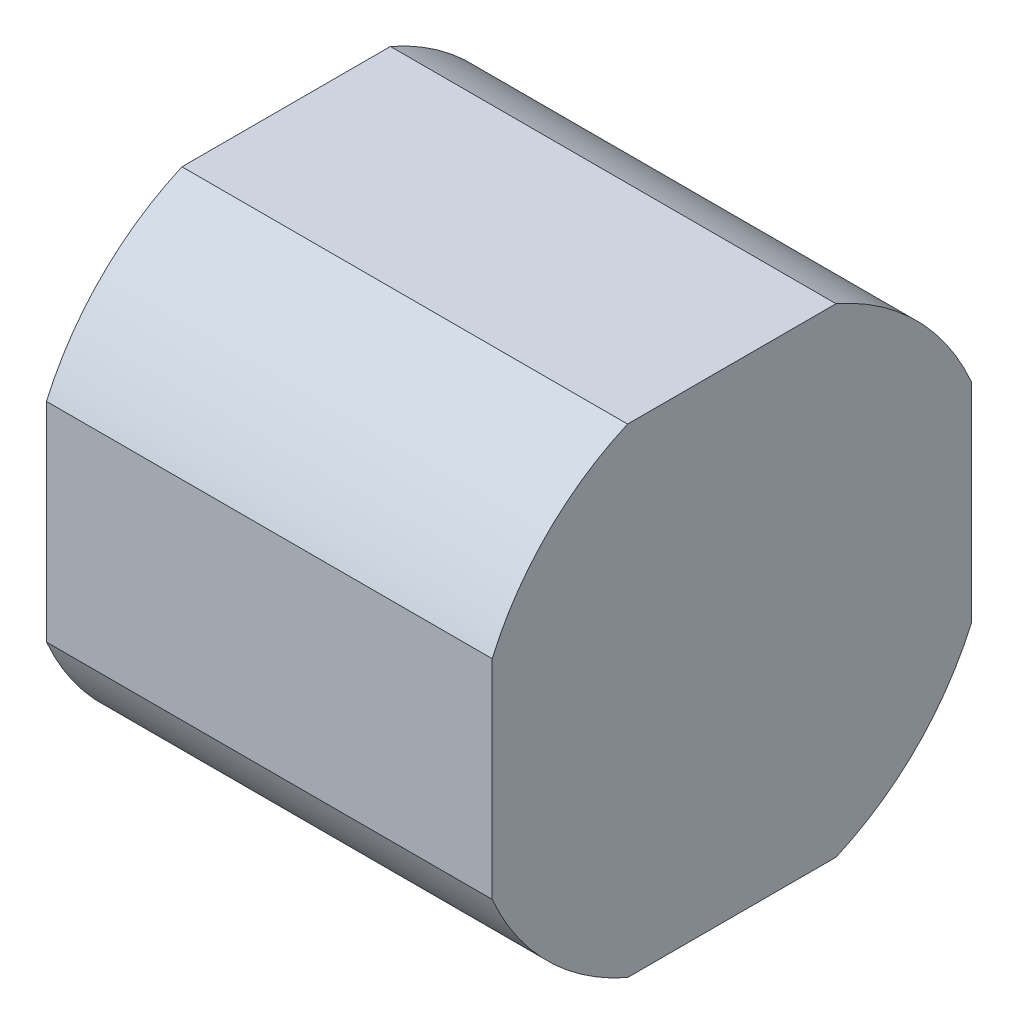
ISO-10303-21;
HEADER;
FILE_DESCRIPTION(('STEP AP214'),'2;1');
FILE_NAME('part.step','',(''),(''),'','','');
FILE_SCHEMA(('AUTOMOTIVE_DESIGN { 1 0 10303 214 1 1 1 1 }'));
ENDSEC;
DATA;
#1=APPLICATION_CONTEXT('core data for automotive mechanical design processes');
#2=APPLICATION_PROTOCOL_DEFINITION('international standard','automotive_design',2000,#1);
#3=PRODUCT_CONTEXT('',#1,'mechanical');
#4=PRODUCT('Part','Part','',(#3));
#5=PRODUCT_RELATED_PRODUCT_CATEGORY('part','',(#4));
#6=PRODUCT_DEFINITION_FORMATION('','',#4);
#7=PRODUCT_DEFINITION_CONTEXT('part definition',#1,'design');
#8=PRODUCT_DEFINITION('design','',#6,#7);
#9=PRODUCT_DEFINITION_SHAPE('','',#8);
#10=(LENGTH_UNIT() NAMED_UNIT(*) SI_UNIT(.MILLI.,.METRE.));
#11=(NAMED_UNIT(*) PLANE_ANGLE_UNIT() SI_UNIT($,.RADIAN.));
#12=(NAMED_UNIT(*) SI_UNIT($,.STERADIAN.) SOLID_ANGLE_UNIT());
#13=UNCERTAINTY_MEASURE_WITH_UNIT(LENGTH_MEASURE(1.E-05),#10,'distance_accuracy_value','');
#14=(GEOMETRIC_REPRESENTATION_CONTEXT(3) GLOBAL_UNCERTAINTY_ASSIGNED_CONTEXT((#13)) GLOBAL_UNIT_ASSIGNED_CONTEXT((#10,
#11,#12)) REPRESENTATION_CONTEXT('',''));
#15=CARTESIAN_POINT('',(0.,0.,0.));
#16=DIRECTION('',(0.,0.,1.));
#17=DIRECTION('',(1.,0.,0.));
#18=AXIS2_PLACEMENT_3D('',#15,#16,#17);
#19=CARTESIAN_POINT('',(18.5,0.,0.));
#20=DIRECTION('',(-1.,0.,0.));
#21=DIRECTION('',(0.,0.,1.));
#22=AXIS2_PLACEMENT_3D('',#19,#20,#21);
#23=CYLINDRICAL_SURFACE('',#22,10.85);
#24=CARTESIAN_POINT('',(0.,0.,0.));
#25=DIRECTION('',(1.,0.,0.));
#26=DIRECTION('',(0.,0.,-1.));
#27=AXIS2_PLACEMENT_3D('',#24,#25,#26);
#28=CIRCLE('',#27,10.85);
#29=CARTESIAN_POINT('',(0.,9.94999999999999,4.32666153055679));
#30=VERTEX_POINT('',#29);
#31=CARTESIAN_POINT('',(0.,4.3266615305568,9.94999999999999));
#32=VERTEX_POINT('',#31);
#33=EDGE_CURVE('E136',#30,#32,#28,.T.);
#34=ORIENTED_EDGE('',*,*,#33,.T.);
#35=DIRECTION('',(-1.,0.,0.));
#36=VECTOR('',#35,1.);
#37=CARTESIAN_POINT('',(18.5,4.3266615305568,9.94999999999999));
#38=LINE('',#37,#36);
#39=CARTESIAN_POINT('',(18.5,4.3266615305568,9.94999999999999));
#40=VERTEX_POINT('',#39);
#41=EDGE_CURVE('E11',#40,#32,#38,.T.);
#42=ORIENTED_EDGE('',*,*,#41,.F.);
#43=CARTESIAN_POINT('',(18.5,0.,0.));
#44=DIRECTION('',(1.,0.,0.));
#45=DIRECTION('',(0.,0.,-1.));
#46=AXIS2_PLACEMENT_3D('',#43,#44,#45);
#47=CIRCLE('',#46,10.85);
#48=CARTESIAN_POINT('',(18.5,9.94999999999999,4.32666153055679));
#49=VERTEX_POINT('',#48);
#50=EDGE_CURVE('E150',#49,#40,#47,.T.);
#51=ORIENTED_EDGE('',*,*,#50,.F.);
#52=DIRECTION('',(-1.,0.,0.));
#53=VECTOR('',#52,1.);
#54=CARTESIAN_POINT('',(18.5,9.94999999999999,4.32666153055679));
#55=LINE('',#54,#53);
#56=EDGE_CURVE('E132',#49,#30,#55,.T.);
#57=ORIENTED_EDGE('',*,*,#56,.T.);
#58=EDGE_LOOP('',(#34,#42,#51,#57));
#59=FACE_BOUND('',#58,.T.);
#60=ADVANCED_FACE('F40',(#59),#23,.T.);
#61=CARTESIAN_POINT('',(18.5,-4.3266615305568,9.94999999999999));
#62=DIRECTION('',(0.,0.,-1.));
#63=DIRECTION('',(-1.,0.,0.));
#64=AXIS2_PLACEMENT_3D('',#61,#62,#63);
#65=PLANE('',#64);
#66=DIRECTION('',(0.,-1.,0.));
#67=VECTOR('',#66,1.);
#68=CARTESIAN_POINT('',(0.,-4.3266615305568,9.94999999999999));
#69=LINE('',#68,#67);
#70=CARTESIAN_POINT('',(0.,-4.32666153055679,9.94999999999999));
#71=VERTEX_POINT('',#70);
#72=EDGE_CURVE('E139',#32,#71,#69,.T.);
#73=ORIENTED_EDGE('',*,*,#72,.T.);
#74=DIRECTION('',(-1.,0.,0.));
#75=VECTOR('',#74,1.);
#76=CARTESIAN_POINT('',(18.5,-4.32666153055679,9.94999999999999));
#77=LINE('',#76,#75);
#78=CARTESIAN_POINT('',(18.5,-4.32666153055679,9.94999999999999));
#79=VERTEX_POINT('',#78);
#80=EDGE_CURVE('E48',#79,#71,#77,.T.);
#81=ORIENTED_EDGE('',*,*,#80,.F.);
#82=DIRECTION('',(0.,-1.,0.));
#83=VECTOR('',#82,1.);
#84=CARTESIAN_POINT('',(18.5,-4.3266615305568,9.94999999999999));
#85=LINE('',#84,#83);
#86=EDGE_CURVE('E99',#40,#79,#85,.T.);
#87=ORIENTED_EDGE('',*,*,#86,.F.);
#88=ORIENTED_EDGE('',*,*,#41,.T.);
#89=EDGE_LOOP('',(#73,#81,#87,#88));
#90=FACE_BOUND('',#89,.T.);
#91=ADVANCED_FACE('F185',(#90),#65,.F.);
#92=CARTESIAN_POINT('',(18.5,0.,0.));
#93=DIRECTION('',(-1.,0.,0.));
#94=DIRECTION('',(0.,0.,1.));
#95=AXIS2_PLACEMENT_3D('',#92,#93,#94);
#96=CYLINDRICAL_SURFACE('',#95,10.85);
#97=CARTESIAN_POINT('',(0.,0.,0.));
#98=DIRECTION('',(1.,0.,0.));
#99=DIRECTION('',(0.,0.,-1.));
#100=AXIS2_PLACEMENT_3D('',#97,#98,#99);
#101=CIRCLE('',#100,10.85);
#102=CARTESIAN_POINT('',(0.,-9.95,4.32666153055678));
#103=VERTEX_POINT('',#102);
#104=EDGE_CURVE('E141',#71,#103,#101,.T.);
#105=ORIENTED_EDGE('',*,*,#104,.T.);
#106=DIRECTION('',(-1.,0.,0.));
#107=VECTOR('',#106,1.);
#108=CARTESIAN_POINT('',(18.5,-9.95,4.32666153055678));
#109=LINE('',#108,#107);
#110=CARTESIAN_POINT('',(18.5,-9.95,4.32666153055678));
#111=VERTEX_POINT('',#110);
#112=EDGE_CURVE('E157',#111,#103,#109,.T.);
#113=ORIENTED_EDGE('',*,*,#112,.F.);
#114=CARTESIAN_POINT('',(18.5,0.,0.));
#115=DIRECTION('',(1.,0.,0.));
#116=DIRECTION('',(0.,0.,-1.));
#117=AXIS2_PLACEMENT_3D('',#114,#115,#116);
#118=CIRCLE('',#117,10.85);
#119=EDGE_CURVE('E165',#79,#111,#118,.T.);
#120=ORIENTED_EDGE('',*,*,#119,.F.);
#121=ORIENTED_EDGE('',*,*,#80,.T.);
#122=EDGE_LOOP('',(#105,#113,#120,#121));
#123=FACE_BOUND('',#122,.T.);
#124=ADVANCED_FACE('F163',(#123),#96,.T.);
#125=CARTESIAN_POINT('',(18.5,-9.95,4.32666153055678));
#126=DIRECTION('',(0.,1.,0.));
#127=DIRECTION('',(0.,0.,1.));
#128=AXIS2_PLACEMENT_3D('',#125,#126,#127);
#129=PLANE('',#128);
#130=DIRECTION('',(0.,0.,-1.));
#131=VECTOR('',#130,1.);
#132=CARTESIAN_POINT('',(0.,-9.95,4.32666153055678));
#133=LINE('',#132,#131);
#134=CARTESIAN_POINT('',(0.,-9.95,-4.32666153055678));
#135=VERTEX_POINT('',#134);
#136=EDGE_CURVE('E143',#103,#135,#133,.T.);
#137=ORIENTED_EDGE('',*,*,#136,.T.);
#138=DIRECTION('',(-1.,0.,0.));
#139=VECTOR('',#138,1.);
#140=CARTESIAN_POINT('',(18.5,-9.95,-4.32666153055678));
#141=LINE('',#140,#139);
#142=CARTESIAN_POINT('',(18.5,-9.95,-4.32666153055678));
#143=VERTEX_POINT('',#142);
#144=EDGE_CURVE('E154',#143,#135,#141,.T.);
#145=ORIENTED_EDGE('',*,*,#144,.F.);
#146=DIRECTION('',(0.,0.,-1.));
#147=VECTOR('',#146,1.);
#148=CARTESIAN_POINT('',(18.5,-9.95,4.32666153055678));
#149=LINE('',#148,#147);
#150=EDGE_CURVE('E177',#111,#143,#149,.T.);
#151=ORIENTED_EDGE('',*,*,#150,.F.);
#152=ORIENTED_EDGE('',*,*,#112,.T.);
#153=EDGE_LOOP('',(#137,#145,#151,#152));
#154=FACE_BOUND('',#153,.T.);
#155=ADVANCED_FACE('F173',(#154),#129,.F.);
#156=CARTESIAN_POINT('',(18.5,0.,0.));
#157=DIRECTION('',(-1.,0.,0.));
#158=DIRECTION('',(0.,0.,1.));
#159=AXIS2_PLACEMENT_3D('',#156,#157,#158);
#160=CYLINDRICAL_SURFACE('',#159,10.85);
#161=CARTESIAN_POINT('',(0.,0.,0.));
#162=DIRECTION('',(1.,0.,0.));
#163=DIRECTION('',(0.,0.,-1.));
#164=AXIS2_PLACEMENT_3D('',#161,#162,#163);
#165=CIRCLE('',#164,10.85);
#166=CARTESIAN_POINT('',(0.,-4.32666153055678,-9.95));
#167=VERTEX_POINT('',#166);
#168=EDGE_CURVE('E145',#135,#167,#165,.T.);
#169=ORIENTED_EDGE('',*,*,#168,.T.);
#170=DIRECTION('',(-1.,0.,0.));
#171=VECTOR('',#170,1.);
#172=CARTESIAN_POINT('',(18.5,-4.32666153055678,-9.95));
#173=LINE('',#172,#171);
#174=CARTESIAN_POINT('',(18.5,-4.32666153055678,-9.95));
#175=VERTEX_POINT('',#174);
#176=EDGE_CURVE('E127',#175,#167,#173,.T.);
#177=ORIENTED_EDGE('',*,*,#176,.F.);
#178=CARTESIAN_POINT('',(18.5,0.,0.));
#179=DIRECTION('',(1.,0.,0.));
#180=DIRECTION('',(0.,0.,-1.));
#181=AXIS2_PLACEMENT_3D('',#178,#179,#180);
#182=CIRCLE('',#181,10.85);
#183=EDGE_CURVE('E118',#143,#175,#182,.T.);
#184=ORIENTED_EDGE('',*,*,#183,.F.);
#185=ORIENTED_EDGE('',*,*,#144,.T.);
#186=EDGE_LOOP('',(#169,#177,#184,#185));
#187=FACE_BOUND('',#186,.T.);
#188=ADVANCED_FACE('F176',(#187),#160,.T.);
#189=CARTESIAN_POINT('',(18.5,-4.32666153055678,-9.95));
#190=DIRECTION('',(0.,0.,1.));
#191=DIRECTION('',(0.,-1.,0.));
#192=AXIS2_PLACEMENT_3D('',#189,#190,#191);
#193=PLANE('',#192);
#194=DIRECTION('',(0.,1.,0.));
#195=VECTOR('',#194,1.);
#196=CARTESIAN_POINT('',(0.,-4.32666153055678,-9.95));
#197=LINE('',#196,#195);
#198=CARTESIAN_POINT('',(0.,4.32666153055678,-9.95));
#199=VERTEX_POINT('',#198);
#200=EDGE_CURVE('E126',#167,#199,#197,.T.);
#201=ORIENTED_EDGE('',*,*,#200,.T.);
#202=DIRECTION('',(-1.,0.,0.));
#203=VECTOR('',#202,1.);
#204=CARTESIAN_POINT('',(18.5,4.32666153055678,-9.95));
#205=LINE('',#204,#203);
#206=CARTESIAN_POINT('',(18.5,4.32666153055678,-9.95));
#207=VERTEX_POINT('',#206);
#208=EDGE_CURVE('E123',#207,#199,#205,.T.);
#209=ORIENTED_EDGE('',*,*,#208,.F.);
#210=DIRECTION('',(0.,1.,0.));
#211=VECTOR('',#210,1.);
#212=CARTESIAN_POINT('',(18.5,-4.32666153055678,-9.95));
#213=LINE('',#212,#211);
#214=EDGE_CURVE('E112',#175,#207,#213,.T.);
#215=ORIENTED_EDGE('',*,*,#214,.F.);
#216=ORIENTED_EDGE('',*,*,#176,.T.);
#217=EDGE_LOOP('',(#201,#209,#215,#216));
#218=FACE_BOUND('',#217,.T.);
#219=ADVANCED_FACE('F124',(#218),#193,.F.);
#220=CARTESIAN_POINT('',(18.5,0.,0.));
#221=DIRECTION('',(-1.,0.,0.));
#222=DIRECTION('',(0.,0.,1.));
#223=AXIS2_PLACEMENT_3D('',#220,#221,#222);
#224=CYLINDRICAL_SURFACE('',#223,10.85);
#225=CARTESIAN_POINT('',(0.,0.,0.));
#226=DIRECTION('',(1.,0.,0.));
#227=DIRECTION('',(0.,0.,-1.));
#228=AXIS2_PLACEMENT_3D('',#225,#226,#227);
#229=CIRCLE('',#228,10.85);
#230=CARTESIAN_POINT('',(0.,9.95,-4.32666153055678));
#231=VERTEX_POINT('',#230);
#232=EDGE_CURVE('E85',#199,#231,#229,.T.);
#233=ORIENTED_EDGE('',*,*,#232,.T.);
#234=DIRECTION('',(-1.,0.,0.));
#235=VECTOR('',#234,1.);
#236=CARTESIAN_POINT('',(18.5,9.95,-4.32666153055678));
#237=LINE('',#236,#235);
#238=CARTESIAN_POINT('',(18.5,9.95,-4.32666153055678));
#239=VERTEX_POINT('',#238);
#240=EDGE_CURVE('E128',#239,#231,#237,.T.);
#241=ORIENTED_EDGE('',*,*,#240,.F.);
#242=CARTESIAN_POINT('',(18.5,0.,0.));
#243=DIRECTION('',(1.,0.,0.));
#244=DIRECTION('',(0.,0.,-1.));
#245=AXIS2_PLACEMENT_3D('',#242,#243,#244);
#246=CIRCLE('',#245,10.85);
#247=EDGE_CURVE('E116',#207,#239,#246,.T.);
#248=ORIENTED_EDGE('',*,*,#247,.F.);
#249=ORIENTED_EDGE('',*,*,#208,.T.);
#250=EDGE_LOOP('',(#233,#241,#248,#249));
#251=FACE_BOUND('',#250,.T.);
#252=ADVANCED_FACE('F130',(#251),#224,.T.);
#253=CARTESIAN_POINT('',(18.5,9.94999999999999,4.32666153055679));
#254=DIRECTION('',(0.,-1.,0.));
#255=DIRECTION('',(0.,0.,-1.));
#256=AXIS2_PLACEMENT_3D('',#253,#254,#255);
#257=PLANE('',#256);
#258=DIRECTION('',(0.,0.,1.));
#259=VECTOR('',#258,1.);
#260=CARTESIAN_POINT('',(0.,9.94999999999999,4.32666153055679));
#261=LINE('',#260,#259);
#262=EDGE_CURVE('E91',#231,#30,#261,.T.);
#263=ORIENTED_EDGE('',*,*,#262,.T.);
#264=ORIENTED_EDGE('',*,*,#56,.F.);
#265=DIRECTION('',(0.,0.,1.));
#266=VECTOR('',#265,1.);
#267=CARTESIAN_POINT('',(18.5,9.94999999999999,4.32666153055679));
#268=LINE('',#267,#266);
#269=EDGE_CURVE('E56',#239,#49,#268,.T.);
#270=ORIENTED_EDGE('',*,*,#269,.F.);
#271=ORIENTED_EDGE('',*,*,#240,.T.);
#272=EDGE_LOOP('',(#263,#264,#270,#271));
#273=FACE_BOUND('',#272,.T.);
#274=ADVANCED_FACE('F201',(#273),#257,.F.);
#275=CARTESIAN_POINT('',(18.5,0.,0.));
#276=DIRECTION('',(1.,0.,0.));
#277=DIRECTION('',(0.,0.,-1.));
#278=AXIS2_PLACEMENT_3D('',#275,#276,#277);
#279=PLANE('',#278);
#280=ORIENTED_EDGE('',*,*,#50,.T.);
#281=ORIENTED_EDGE('',*,*,#86,.T.);
#282=ORIENTED_EDGE('',*,*,#119,.T.);
#283=ORIENTED_EDGE('',*,*,#150,.T.);
#284=ORIENTED_EDGE('',*,*,#183,.T.);
#285=ORIENTED_EDGE('',*,*,#214,.T.);
#286=ORIENTED_EDGE('',*,*,#247,.T.);
#287=ORIENTED_EDGE('',*,*,#269,.T.);
#288=EDGE_LOOP('',(#280,#281,#282,#283,#284,#285,#286,#287));
#289=FACE_BOUND('',#288,.T.);
#290=ADVANCED_FACE('F114',(#289),#279,.T.);
#291=CARTESIAN_POINT('',(0.,0.,0.));
#292=DIRECTION('',(1.,0.,0.));
#293=DIRECTION('',(0.,0.,-1.));
#294=AXIS2_PLACEMENT_3D('',#291,#292,#293);
#295=PLANE('',#294);
#296=ORIENTED_EDGE('',*,*,#33,.F.);
#297=ORIENTED_EDGE('',*,*,#262,.F.);
#298=ORIENTED_EDGE('',*,*,#232,.F.);
#299=ORIENTED_EDGE('',*,*,#200,.F.);
#300=ORIENTED_EDGE('',*,*,#168,.F.);
#301=ORIENTED_EDGE('',*,*,#136,.F.);
#302=ORIENTED_EDGE('',*,*,#104,.F.);
#303=ORIENTED_EDGE('',*,*,#72,.F.);
#304=EDGE_LOOP('',(#296,#297,#298,#299,#300,#301,#302,#303));
#305=FACE_BOUND('',#304,.T.);
#306=ADVANCED_FACE('F169',(#305),#295,.F.);
#307=CLOSED_SHELL('',(#60,#91,#124,#155,#188,#219,#252,#274,#290,#306));
#308=MANIFOLD_SOLID_BREP('B2',#307);
#309=ADVANCED_BREP_SHAPE_REPRESENTATION('',(#18,#308),#14);
#310=SHAPE_DEFINITION_REPRESENTATION(#9,#309);
ENDSEC;
END-ISO-10303-21;
